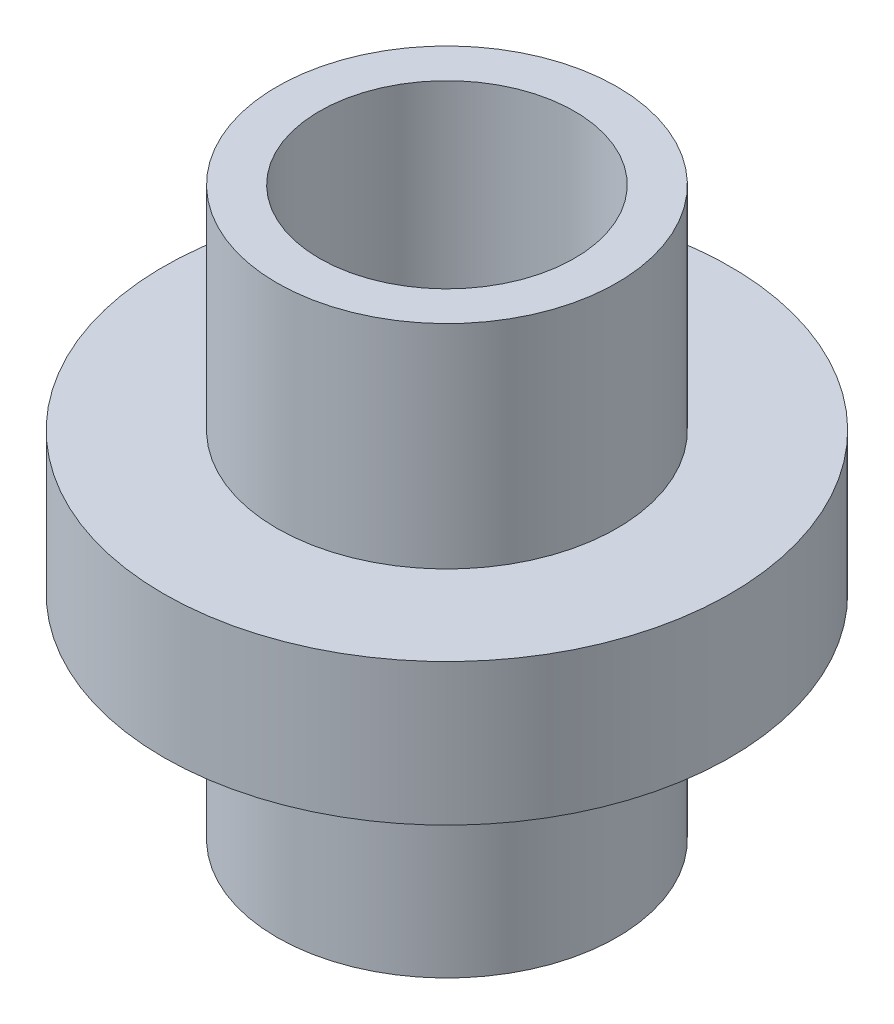
ISO-10303-21;
HEADER;
FILE_DESCRIPTION(('STEP AP214'),'2;1');
FILE_NAME('part.step','',(''),(''),'','','');
FILE_SCHEMA(('AUTOMOTIVE_DESIGN { 1 0 10303 214 1 1 1 1 }'));
ENDSEC;
DATA;
#1=APPLICATION_CONTEXT('core data for automotive mechanical design processes');
#2=APPLICATION_PROTOCOL_DEFINITION('international standard','automotive_design',2000,#1);
#3=PRODUCT_CONTEXT('',#1,'mechanical');
#4=PRODUCT('Part','Part','',(#3));
#5=PRODUCT_RELATED_PRODUCT_CATEGORY('part','',(#4));
#6=PRODUCT_DEFINITION_FORMATION('','',#4);
#7=PRODUCT_DEFINITION_CONTEXT('part definition',#1,'design');
#8=PRODUCT_DEFINITION('design','',#6,#7);
#9=PRODUCT_DEFINITION_SHAPE('','',#8);
#10=(LENGTH_UNIT() NAMED_UNIT(*) SI_UNIT(.MILLI.,.METRE.));
#11=(NAMED_UNIT(*) PLANE_ANGLE_UNIT() SI_UNIT($,.RADIAN.));
#12=(NAMED_UNIT(*) SI_UNIT($,.STERADIAN.) SOLID_ANGLE_UNIT());
#13=UNCERTAINTY_MEASURE_WITH_UNIT(LENGTH_MEASURE(1.E-05),#10,'distance_accuracy_value','');
#14=(GEOMETRIC_REPRESENTATION_CONTEXT(3) GLOBAL_UNCERTAINTY_ASSIGNED_CONTEXT((#13)) GLOBAL_UNIT_ASSIGNED_CONTEXT((#10,
#11,#12)) REPRESENTATION_CONTEXT('',''));
#15=CARTESIAN_POINT('',(0.,0.,0.));
#16=DIRECTION('',(0.,0.,1.));
#17=DIRECTION('',(1.,0.,0.));
#18=AXIS2_PLACEMENT_3D('',#15,#16,#17);
#19=CARTESIAN_POINT('',(0.,10.,0.));
#20=DIRECTION('',(0.,1.,0.));
#21=DIRECTION('',(0.,0.,1.));
#22=AXIS2_PLACEMENT_3D('',#19,#20,#21);
#23=CYLINDRICAL_SURFACE('',#22,4.5);
#24=CARTESIAN_POINT('',(0.,-10.,0.));
#25=DIRECTION('',(0.,1.,0.));
#26=DIRECTION('',(0.,0.,1.));
#27=AXIS2_PLACEMENT_3D('',#24,#25,#26);
#28=CIRCLE('',#27,4.5);
#29=CARTESIAN_POINT('',(0.,-10.,4.5));
#30=VERTEX_POINT('',#29);
#31=EDGE_CURVE('E59',#30,#30,#28,.T.);
#32=ORIENTED_EDGE('',*,*,#31,.F.);
#33=EDGE_LOOP('',(#32));
#34=FACE_BOUND('',#33,.T.);
#35=CARTESIAN_POINT('',(0.,10.,0.));
#36=DIRECTION('',(0.,1.,0.));
#37=DIRECTION('',(0.,0.,1.));
#38=AXIS2_PLACEMENT_3D('',#35,#36,#37);
#39=CIRCLE('',#38,4.5);
#40=CARTESIAN_POINT('',(0.,10.,4.5));
#41=VERTEX_POINT('',#40);
#42=EDGE_CURVE('E10',#41,#41,#39,.T.);
#43=ORIENTED_EDGE('',*,*,#42,.T.);
#44=EDGE_LOOP('',(#43));
#45=FACE_BOUND('',#44,.T.);
#46=ADVANCED_FACE('F31',(#34,#45),#23,.F.);
#47=CARTESIAN_POINT('',(4.5,10.,0.));
#48=DIRECTION('',(0.,-1.,0.));
#49=DIRECTION('',(0.,0.,-1.));
#50=AXIS2_PLACEMENT_3D('',#47,#48,#49);
#51=PLANE('',#50);
#52=ORIENTED_EDGE('',*,*,#42,.F.);
#53=EDGE_LOOP('',(#52));
#54=FACE_BOUND('',#53,.T.);
#55=CARTESIAN_POINT('',(0.,10.,0.));
#56=DIRECTION('',(0.,1.,0.));
#57=DIRECTION('',(0.,0.,1.));
#58=AXIS2_PLACEMENT_3D('',#55,#56,#57);
#59=CIRCLE('',#58,6.);
#60=CARTESIAN_POINT('',(0.,10.,6.));
#61=VERTEX_POINT('',#60);
#62=EDGE_CURVE('E37',#61,#61,#59,.T.);
#63=ORIENTED_EDGE('',*,*,#62,.T.);
#64=EDGE_LOOP('',(#63));
#65=FACE_BOUND('',#64,.T.);
#66=ADVANCED_FACE('F66',(#54,#65),#51,.F.);
#67=CARTESIAN_POINT('',(0.,10.,0.));
#68=DIRECTION('',(0.,1.,0.));
#69=DIRECTION('',(0.,0.,1.));
#70=AXIS2_PLACEMENT_3D('',#67,#68,#69);
#71=CYLINDRICAL_SURFACE('',#70,6.);
#72=ORIENTED_EDGE('',*,*,#62,.F.);
#73=EDGE_LOOP('',(#72));
#74=FACE_BOUND('',#73,.T.);
#75=CARTESIAN_POINT('',(0.,2.5,0.));
#76=DIRECTION('',(0.,1.,0.));
#77=DIRECTION('',(0.,0.,1.));
#78=AXIS2_PLACEMENT_3D('',#75,#76,#77);
#79=CIRCLE('',#78,6.);
#80=CARTESIAN_POINT('',(0.,2.5,6.));
#81=VERTEX_POINT('',#80);
#82=EDGE_CURVE('E41',#81,#81,#79,.T.);
#83=ORIENTED_EDGE('',*,*,#82,.T.);
#84=EDGE_LOOP('',(#83));
#85=FACE_BOUND('',#84,.T.);
#86=ADVANCED_FACE('F70',(#74,#85),#71,.T.);
#87=CARTESIAN_POINT('',(6.,2.5,0.));
#88=DIRECTION('',(0.,-1.,0.));
#89=DIRECTION('',(0.,0.,-1.));
#90=AXIS2_PLACEMENT_3D('',#87,#88,#89);
#91=PLANE('',#90);
#92=ORIENTED_EDGE('',*,*,#82,.F.);
#93=EDGE_LOOP('',(#92));
#94=FACE_BOUND('',#93,.T.);
#95=CARTESIAN_POINT('',(0.,2.5,0.));
#96=DIRECTION('',(0.,1.,0.));
#97=DIRECTION('',(0.,0.,1.));
#98=AXIS2_PLACEMENT_3D('',#95,#96,#97);
#99=CIRCLE('',#98,10.);
#100=CARTESIAN_POINT('',(0.,2.5,10.));
#101=VERTEX_POINT('',#100);
#102=EDGE_CURVE('E45',#101,#101,#99,.T.);
#103=ORIENTED_EDGE('',*,*,#102,.T.);
#104=EDGE_LOOP('',(#103));
#105=FACE_BOUND('',#104,.T.);
#106=ADVANCED_FACE('F75',(#94,#105),#91,.F.);
#107=CARTESIAN_POINT('',(0.,10.,0.));
#108=DIRECTION('',(0.,1.,0.));
#109=DIRECTION('',(0.,0.,1.));
#110=AXIS2_PLACEMENT_3D('',#107,#108,#109);
#111=CYLINDRICAL_SURFACE('',#110,10.);
#112=ORIENTED_EDGE('',*,*,#102,.F.);
#113=EDGE_LOOP('',(#112));
#114=FACE_BOUND('',#113,.T.);
#115=CARTESIAN_POINT('',(0.,-2.5,0.));
#116=DIRECTION('',(0.,1.,0.));
#117=DIRECTION('',(0.,0.,1.));
#118=AXIS2_PLACEMENT_3D('',#115,#116,#117);
#119=CIRCLE('',#118,10.);
#120=CARTESIAN_POINT('',(0.,-2.5,10.));
#121=VERTEX_POINT('',#120);
#122=EDGE_CURVE('E50',#121,#121,#119,.T.);
#123=ORIENTED_EDGE('',*,*,#122,.T.);
#124=EDGE_LOOP('',(#123));
#125=FACE_BOUND('',#124,.T.);
#126=ADVANCED_FACE('F81',(#114,#125),#111,.T.);
#127=CARTESIAN_POINT('',(10.,-2.5,0.));
#128=DIRECTION('',(0.,1.,0.));
#129=DIRECTION('',(0.,0.,1.));
#130=AXIS2_PLACEMENT_3D('',#127,#128,#129);
#131=PLANE('',#130);
#132=ORIENTED_EDGE('',*,*,#122,.F.);
#133=EDGE_LOOP('',(#132));
#134=FACE_BOUND('',#133,.T.);
#135=CARTESIAN_POINT('',(0.,-2.5,0.));
#136=DIRECTION('',(0.,1.,0.));
#137=DIRECTION('',(0.,0.,1.));
#138=AXIS2_PLACEMENT_3D('',#135,#136,#137);
#139=CIRCLE('',#138,6.);
#140=CARTESIAN_POINT('',(0.,-2.5,6.));
#141=VERTEX_POINT('',#140);
#142=EDGE_CURVE('E53',#141,#141,#139,.T.);
#143=ORIENTED_EDGE('',*,*,#142,.T.);
#144=EDGE_LOOP('',(#143));
#145=FACE_BOUND('',#144,.T.);
#146=ADVANCED_FACE('F85',(#134,#145),#131,.F.);
#147=CARTESIAN_POINT('',(0.,10.,0.));
#148=DIRECTION('',(0.,1.,0.));
#149=DIRECTION('',(0.,0.,1.));
#150=AXIS2_PLACEMENT_3D('',#147,#148,#149);
#151=CYLINDRICAL_SURFACE('',#150,6.);
#152=ORIENTED_EDGE('',*,*,#142,.F.);
#153=EDGE_LOOP('',(#152));
#154=FACE_BOUND('',#153,.T.);
#155=CARTESIAN_POINT('',(0.,-10.,0.));
#156=DIRECTION('',(0.,1.,0.));
#157=DIRECTION('',(0.,0.,1.));
#158=AXIS2_PLACEMENT_3D('',#155,#156,#157);
#159=CIRCLE('',#158,6.);
#160=CARTESIAN_POINT('',(0.,-10.,6.));
#161=VERTEX_POINT('',#160);
#162=EDGE_CURVE('E56',#161,#161,#159,.T.);
#163=ORIENTED_EDGE('',*,*,#162,.T.);
#164=EDGE_LOOP('',(#163));
#165=FACE_BOUND('',#164,.T.);
#166=ADVANCED_FACE('F89',(#154,#165),#151,.T.);
#167=CARTESIAN_POINT('',(6.,-10.,0.));
#168=DIRECTION('',(0.,1.,0.));
#169=DIRECTION('',(0.,0.,1.));
#170=AXIS2_PLACEMENT_3D('',#167,#168,#169);
#171=PLANE('',#170);
#172=ORIENTED_EDGE('',*,*,#162,.F.);
#173=EDGE_LOOP('',(#172));
#174=FACE_BOUND('',#173,.T.);
#175=ORIENTED_EDGE('',*,*,#31,.T.);
#176=EDGE_LOOP('',(#175));
#177=FACE_BOUND('',#176,.T.);
#178=ADVANCED_FACE('F63',(#174,#177),#171,.F.);
#179=CLOSED_SHELL('',(#46,#66,#86,#106,#126,#146,#166,#178));
#180=MANIFOLD_SOLID_BREP('B2',#179);
#181=ADVANCED_BREP_SHAPE_REPRESENTATION('',(#18,#180),#14);
#182=SHAPE_DEFINITION_REPRESENTATION(#9,#181);
ENDSEC;
END-ISO-10303-21;
